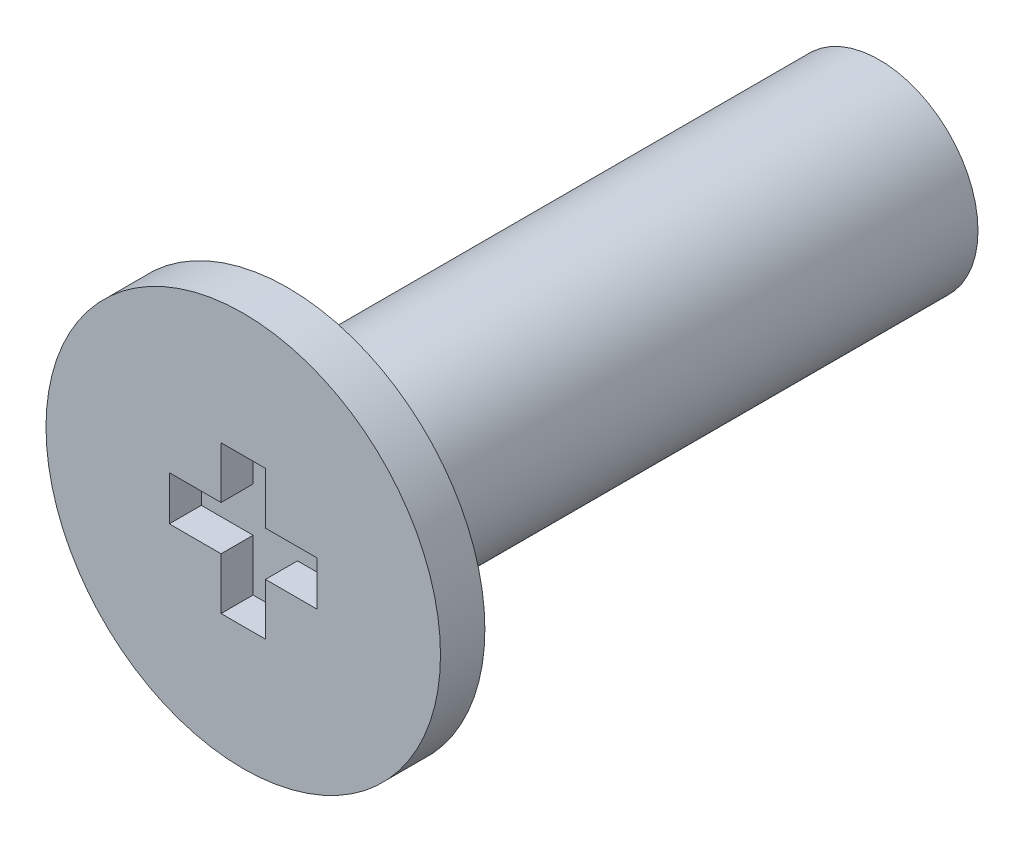
ISO-10303-21;
HEADER;
FILE_DESCRIPTION(('STEP AP214'),'2;1');
FILE_NAME('part.step','',(''),(''),'','','');
FILE_SCHEMA(('AUTOMOTIVE_DESIGN { 1 0 10303 214 1 1 1 1 }'));
ENDSEC;
DATA;
#1=APPLICATION_CONTEXT('core data for automotive mechanical design processes');
#2=APPLICATION_PROTOCOL_DEFINITION('international standard','automotive_design',2000,#1);
#3=PRODUCT_CONTEXT('',#1,'mechanical');
#4=PRODUCT('Part','Part','',(#3));
#5=PRODUCT_RELATED_PRODUCT_CATEGORY('part','',(#4));
#6=PRODUCT_DEFINITION_FORMATION('','',#4);
#7=PRODUCT_DEFINITION_CONTEXT('part definition',#1,'design');
#8=PRODUCT_DEFINITION('design','',#6,#7);
#9=PRODUCT_DEFINITION_SHAPE('','',#8);
#10=(LENGTH_UNIT() NAMED_UNIT(*) SI_UNIT(.MILLI.,.METRE.));
#11=(NAMED_UNIT(*) PLANE_ANGLE_UNIT() SI_UNIT($,.RADIAN.));
#12=(NAMED_UNIT(*) SI_UNIT($,.STERADIAN.) SOLID_ANGLE_UNIT());
#13=UNCERTAINTY_MEASURE_WITH_UNIT(LENGTH_MEASURE(1.E-05),#10,'distance_accuracy_value','');
#14=(GEOMETRIC_REPRESENTATION_CONTEXT(3) GLOBAL_UNCERTAINTY_ASSIGNED_CONTEXT((#13)) GLOBAL_UNIT_ASSIGNED_CONTEXT((#10,
#11,#12)) REPRESENTATION_CONTEXT('',''));
#15=CARTESIAN_POINT('',(0.,0.,0.));
#16=DIRECTION('',(0.,0.,1.));
#17=DIRECTION('',(1.,0.,0.));
#18=AXIS2_PLACEMENT_3D('',#15,#16,#17);
#19=CARTESIAN_POINT('',(0.,0.,-12.));
#20=DIRECTION('',(0.,0.,1.));
#21=DIRECTION('',(1.,0.,0.));
#22=AXIS2_PLACEMENT_3D('',#19,#20,#21);
#23=CYLINDRICAL_SURFACE('',#22,2.);
#24=CARTESIAN_POINT('',(0.,0.,-12.));
#25=DIRECTION('',(0.,0.,1.));
#26=DIRECTION('',(1.,0.,0.));
#27=AXIS2_PLACEMENT_3D('',#24,#25,#26);
#28=CIRCLE('',#27,2.);
#29=CARTESIAN_POINT('',(2.,0.,-12.));
#30=VERTEX_POINT('',#29);
#31=EDGE_CURVE('E245',#30,#30,#28,.T.);
#32=ORIENTED_EDGE('',*,*,#31,.T.);
#33=EDGE_LOOP('',(#32));
#34=FACE_BOUND('',#33,.T.);
#35=CARTESIAN_POINT('',(0.,0.,0.));
#36=DIRECTION('',(0.,0.,1.));
#37=DIRECTION('',(1.,0.,0.));
#38=AXIS2_PLACEMENT_3D('',#35,#36,#37);
#39=CIRCLE('',#38,2.);
#40=CARTESIAN_POINT('',(2.,0.,0.));
#41=VERTEX_POINT('',#40);
#42=EDGE_CURVE('E241',#41,#41,#39,.T.);
#43=ORIENTED_EDGE('',*,*,#42,.F.);
#44=EDGE_LOOP('',(#43));
#45=FACE_BOUND('',#44,.T.);
#46=ADVANCED_FACE('F44',(#34,#45),#23,.T.);
#47=CARTESIAN_POINT('',(0.,0.,-12.));
#48=DIRECTION('',(0.,0.,1.));
#49=DIRECTION('',(1.,0.,0.));
#50=AXIS2_PLACEMENT_3D('',#47,#48,#49);
#51=PLANE('',#50);
#52=ORIENTED_EDGE('',*,*,#31,.F.);
#53=EDGE_LOOP('',(#52));
#54=FACE_BOUND('',#53,.T.);
#55=ADVANCED_FACE('F326',(#54),#51,.F.);
#56=CARTESIAN_POINT('',(0.,0.,0.));
#57=DIRECTION('',(0.,0.,1.));
#58=DIRECTION('',(1.,0.,0.));
#59=AXIS2_PLACEMENT_3D('',#56,#57,#58);
#60=PLANE('',#59);
#61=ORIENTED_EDGE('',*,*,#42,.T.);
#62=EDGE_LOOP('',(#61));
#63=FACE_BOUND('',#62,.T.);
#64=CARTESIAN_POINT('',(0.,0.,0.));
#65=DIRECTION('',(0.,0.,-1.));
#66=DIRECTION('',(-1.,0.,0.));
#67=AXIS2_PLACEMENT_3D('',#64,#65,#66);
#68=CIRCLE('',#67,4.);
#69=CARTESIAN_POINT('',(-4.,0.,0.));
#70=VERTEX_POINT('',#69);
#71=EDGE_CURVE('E240',#70,#70,#68,.T.);
#72=ORIENTED_EDGE('',*,*,#71,.T.);
#73=EDGE_LOOP('',(#72));
#74=FACE_BOUND('',#73,.T.);
#75=ADVANCED_FACE('F331',(#63,#74),#60,.F.);
#76=CARTESIAN_POINT('',(0.,0.,-2.));
#77=DIRECTION('',(0.,0.,-1.));
#78=DIRECTION('',(-1.,0.,0.));
#79=AXIS2_PLACEMENT_3D('',#76,#77,#78);
#80=CYLINDRICAL_SURFACE('',#79,4.);
#81=ORIENTED_EDGE('',*,*,#71,.F.);
#82=EDGE_LOOP('',(#81));
#83=FACE_BOUND('',#82,.T.);
#84=CARTESIAN_POINT('',(0.,0.,0.9));
#85=DIRECTION('',(0.,0.,-1.));
#86=DIRECTION('',(-1.,0.,0.));
#87=AXIS2_PLACEMENT_3D('',#84,#85,#86);
#88=CIRCLE('',#87,4.);
#89=CARTESIAN_POINT('',(-4.,0.,0.9));
#90=VERTEX_POINT('',#89);
#91=EDGE_CURVE('E196',#90,#90,#88,.T.);
#92=ORIENTED_EDGE('',*,*,#91,.T.);
#93=EDGE_LOOP('',(#92));
#94=FACE_BOUND('',#93,.T.);
#95=ADVANCED_FACE('F341',(#83,#94),#80,.T.);
#96=CARTESIAN_POINT('',(4.,0.,0.9));
#97=DIRECTION('',(0.,0.,-1.));
#98=DIRECTION('',(-1.,0.,0.));
#99=AXIS2_PLACEMENT_3D('',#96,#97,#98);
#100=PLANE('',#99);
#101=DIRECTION('',(-1.,0.,0.));
#102=VECTOR('',#101,1.);
#103=CARTESIAN_POINT('',(4.,-1.5,0.9));
#104=LINE('',#103,#102);
#105=CARTESIAN_POINT('',(0.45,-1.5,0.9));
#106=VERTEX_POINT('',#105);
#107=CARTESIAN_POINT('',(-0.45,-1.5,0.9));
#108=VERTEX_POINT('',#107);
#109=EDGE_CURVE('E246',#106,#108,#104,.T.);
#110=ORIENTED_EDGE('',*,*,#109,.T.);
#111=DIRECTION('',(0.,1.,0.));
#112=VECTOR('',#111,1.);
#113=CARTESIAN_POINT('',(-0.45,0.,0.9));
#114=LINE('',#113,#112);
#115=CARTESIAN_POINT('',(-0.45,-0.45,0.9));
#116=VERTEX_POINT('',#115);
#117=EDGE_CURVE('E11',#108,#116,#114,.T.);
#118=ORIENTED_EDGE('',*,*,#117,.T.);
#119=DIRECTION('',(-1.,0.,0.));
#120=VECTOR('',#119,1.);
#121=CARTESIAN_POINT('',(4.,-0.45,0.9));
#122=LINE('',#121,#120);
#123=CARTESIAN_POINT('',(-1.5,-0.45,0.9));
#124=VERTEX_POINT('',#123);
#125=EDGE_CURVE('E52',#116,#124,#122,.T.);
#126=ORIENTED_EDGE('',*,*,#125,.T.);
#127=DIRECTION('',(0.,1.,0.));
#128=VECTOR('',#127,1.);
#129=CARTESIAN_POINT('',(-1.5,0.,0.9));
#130=LINE('',#129,#128);
#131=CARTESIAN_POINT('',(-1.5,0.45,0.9));
#132=VERTEX_POINT('',#131);
#133=EDGE_CURVE('E281',#124,#132,#130,.T.);
#134=ORIENTED_EDGE('',*,*,#133,.T.);
#135=DIRECTION('',(1.,0.,0.));
#136=VECTOR('',#135,1.);
#137=CARTESIAN_POINT('',(4.,0.45,0.9));
#138=LINE('',#137,#136);
#139=CARTESIAN_POINT('',(-0.45,0.45,0.9));
#140=VERTEX_POINT('',#139);
#141=EDGE_CURVE('E279',#132,#140,#138,.T.);
#142=ORIENTED_EDGE('',*,*,#141,.T.);
#143=DIRECTION('',(0.,1.,0.));
#144=VECTOR('',#143,1.);
#145=CARTESIAN_POINT('',(-0.45,0.,0.9));
#146=LINE('',#145,#144);
#147=CARTESIAN_POINT('',(-0.45,1.5,0.9));
#148=VERTEX_POINT('',#147);
#149=EDGE_CURVE('E276',#140,#148,#146,.T.);
#150=ORIENTED_EDGE('',*,*,#149,.T.);
#151=DIRECTION('',(1.,0.,0.));
#152=VECTOR('',#151,1.);
#153=CARTESIAN_POINT('',(4.,1.5,0.9));
#154=LINE('',#153,#152);
#155=CARTESIAN_POINT('',(0.45,1.5,0.9));
#156=VERTEX_POINT('',#155);
#157=EDGE_CURVE('E275',#148,#156,#154,.T.);
#158=ORIENTED_EDGE('',*,*,#157,.T.);
#159=DIRECTION('',(0.,-1.,0.));
#160=VECTOR('',#159,1.);
#161=CARTESIAN_POINT('',(0.45,0.,0.9));
#162=LINE('',#161,#160);
#163=CARTESIAN_POINT('',(0.45,0.45,0.9));
#164=VERTEX_POINT('',#163);
#165=EDGE_CURVE('E268',#156,#164,#162,.T.);
#166=ORIENTED_EDGE('',*,*,#165,.T.);
#167=DIRECTION('',(1.,0.,0.));
#168=VECTOR('',#167,1.);
#169=CARTESIAN_POINT('',(4.,0.45,0.9));
#170=LINE('',#169,#168);
#171=CARTESIAN_POINT('',(1.5,0.45,0.9));
#172=VERTEX_POINT('',#171);
#173=EDGE_CURVE('E264',#164,#172,#170,.T.);
#174=ORIENTED_EDGE('',*,*,#173,.T.);
#175=DIRECTION('',(0.,-1.,0.));
#176=VECTOR('',#175,1.);
#177=CARTESIAN_POINT('',(1.5,0.,0.9));
#178=LINE('',#177,#176);
#179=CARTESIAN_POINT('',(1.5,-0.45,0.9));
#180=VERTEX_POINT('',#179);
#181=EDGE_CURVE('E259',#172,#180,#178,.T.);
#182=ORIENTED_EDGE('',*,*,#181,.T.);
#183=DIRECTION('',(-1.,0.,0.));
#184=VECTOR('',#183,1.);
#185=CARTESIAN_POINT('',(4.,-0.45,0.9));
#186=LINE('',#185,#184);
#187=CARTESIAN_POINT('',(0.45,-0.45,0.9));
#188=VERTEX_POINT('',#187);
#189=EDGE_CURVE('E258',#180,#188,#186,.T.);
#190=ORIENTED_EDGE('',*,*,#189,.T.);
#191=DIRECTION('',(0.,-1.,0.));
#192=VECTOR('',#191,1.);
#193=CARTESIAN_POINT('',(0.45,0.,0.9));
#194=LINE('',#193,#192);
#195=EDGE_CURVE('E255',#188,#106,#194,.T.);
#196=ORIENTED_EDGE('',*,*,#195,.T.);
#197=EDGE_LOOP('',(#110,#118,#126,#134,#142,#150,#158,#166,#174,#182,#190,#196));
#198=FACE_BOUND('',#197,.T.);
#199=ORIENTED_EDGE('',*,*,#91,.F.);
#200=EDGE_LOOP('',(#199));
#201=FACE_BOUND('',#200,.T.);
#202=ADVANCED_FACE('F286',(#198,#201),#100,.F.);
#203=CARTESIAN_POINT('',(-0.45,-0.45,0.25));
#204=DIRECTION('',(-1.,0.,0.));
#205=DIRECTION('',(0.,0.,1.));
#206=AXIS2_PLACEMENT_3D('',#203,#204,#205);
#207=PLANE('',#206);
#208=DIRECTION('',(0.,0.,1.));
#209=VECTOR('',#208,1.);
#210=CARTESIAN_POINT('',(-0.45,-1.5,0.25));
#211=LINE('',#210,#209);
#212=CARTESIAN_POINT('',(-0.45,-1.5,0.25));
#213=VERTEX_POINT('',#212);
#214=EDGE_CURVE('E58',#213,#108,#211,.T.);
#215=ORIENTED_EDGE('',*,*,#214,.F.);
#216=DIRECTION('',(0.,-1.,0.));
#217=VECTOR('',#216,1.);
#218=CARTESIAN_POINT('',(-0.45,-0.45,0.25));
#219=LINE('',#218,#217);
#220=CARTESIAN_POINT('',(-0.45,-0.45,0.25));
#221=VERTEX_POINT('',#220);
#222=EDGE_CURVE('E133',#221,#213,#219,.T.);
#223=ORIENTED_EDGE('',*,*,#222,.F.);
#224=DIRECTION('',(0.,0.,1.));
#225=VECTOR('',#224,1.);
#226=CARTESIAN_POINT('',(-0.45,-0.45,0.25));
#227=LINE('',#226,#225);
#228=EDGE_CURVE('E193',#221,#116,#227,.T.);
#229=ORIENTED_EDGE('',*,*,#228,.T.);
#230=ORIENTED_EDGE('',*,*,#117,.F.);
#231=EDGE_LOOP('',(#215,#223,#229,#230));
#232=FACE_BOUND('',#231,.T.);
#233=ADVANCED_FACE('F134',(#232),#207,.F.);
#234=CARTESIAN_POINT('',(-1.5,-0.45,0.25));
#235=DIRECTION('',(0.,-1.,0.));
#236=DIRECTION('',(0.,0.,-1.));
#237=AXIS2_PLACEMENT_3D('',#234,#235,#236);
#238=PLANE('',#237);
#239=ORIENTED_EDGE('',*,*,#228,.F.);
#240=DIRECTION('',(1.,0.,0.));
#241=VECTOR('',#240,1.);
#242=CARTESIAN_POINT('',(-1.5,-0.45,0.25));
#243=LINE('',#242,#241);
#244=CARTESIAN_POINT('',(-1.5,-0.45,0.25));
#245=VERTEX_POINT('',#244);
#246=EDGE_CURVE('E138',#245,#221,#243,.T.);
#247=ORIENTED_EDGE('',*,*,#246,.F.);
#248=DIRECTION('',(0.,0.,1.));
#249=VECTOR('',#248,1.);
#250=CARTESIAN_POINT('',(-1.5,-0.45,0.25));
#251=LINE('',#250,#249);
#252=EDGE_CURVE('E200',#245,#124,#251,.T.);
#253=ORIENTED_EDGE('',*,*,#252,.T.);
#254=ORIENTED_EDGE('',*,*,#125,.F.);
#255=EDGE_LOOP('',(#239,#247,#253,#254));
#256=FACE_BOUND('',#255,.T.);
#257=ADVANCED_FACE('F320',(#256),#238,.F.);
#258=CARTESIAN_POINT('',(-1.5,0.45,0.25));
#259=DIRECTION('',(-1.,0.,0.));
#260=DIRECTION('',(0.,0.,1.));
#261=AXIS2_PLACEMENT_3D('',#258,#259,#260);
#262=PLANE('',#261);
#263=ORIENTED_EDGE('',*,*,#252,.F.);
#264=DIRECTION('',(0.,-1.,0.));
#265=VECTOR('',#264,1.);
#266=CARTESIAN_POINT('',(-1.5,0.45,0.25));
#267=LINE('',#266,#265);
#268=CARTESIAN_POINT('',(-1.5,0.45,0.25));
#269=VERTEX_POINT('',#268);
#270=EDGE_CURVE('E186',#269,#245,#267,.T.);
#271=ORIENTED_EDGE('',*,*,#270,.F.);
#272=DIRECTION('',(0.,0.,1.));
#273=VECTOR('',#272,1.);
#274=CARTESIAN_POINT('',(-1.5,0.45,0.25));
#275=LINE('',#274,#273);
#276=EDGE_CURVE('E199',#269,#132,#275,.T.);
#277=ORIENTED_EDGE('',*,*,#276,.T.);
#278=ORIENTED_EDGE('',*,*,#133,.F.);
#279=EDGE_LOOP('',(#263,#271,#277,#278));
#280=FACE_BOUND('',#279,.T.);
#281=ADVANCED_FACE('F316',(#280),#262,.F.);
#282=CARTESIAN_POINT('',(-0.45,0.45,0.25));
#283=DIRECTION('',(0.,1.,0.));
#284=DIRECTION('',(0.,0.,1.));
#285=AXIS2_PLACEMENT_3D('',#282,#283,#284);
#286=PLANE('',#285);
#287=ORIENTED_EDGE('',*,*,#276,.F.);
#288=DIRECTION('',(-1.,0.,0.));
#289=VECTOR('',#288,1.);
#290=CARTESIAN_POINT('',(-0.45,0.45,0.25));
#291=LINE('',#290,#289);
#292=CARTESIAN_POINT('',(-0.45,0.45,0.25));
#293=VERTEX_POINT('',#292);
#294=EDGE_CURVE('E185',#293,#269,#291,.T.);
#295=ORIENTED_EDGE('',*,*,#294,.F.);
#296=DIRECTION('',(0.,0.,1.));
#297=VECTOR('',#296,1.);
#298=CARTESIAN_POINT('',(-0.45,0.45,0.25));
#299=LINE('',#298,#297);
#300=EDGE_CURVE('E203',#293,#140,#299,.T.);
#301=ORIENTED_EDGE('',*,*,#300,.T.);
#302=ORIENTED_EDGE('',*,*,#141,.F.);
#303=EDGE_LOOP('',(#287,#295,#301,#302));
#304=FACE_BOUND('',#303,.T.);
#305=ADVANCED_FACE('F311',(#304),#286,.F.);
#306=CARTESIAN_POINT('',(-0.45,1.5,0.25));
#307=DIRECTION('',(-1.,0.,0.));
#308=DIRECTION('',(0.,0.,1.));
#309=AXIS2_PLACEMENT_3D('',#306,#307,#308);
#310=PLANE('',#309);
#311=ORIENTED_EDGE('',*,*,#300,.F.);
#312=DIRECTION('',(0.,-1.,0.));
#313=VECTOR('',#312,1.);
#314=CARTESIAN_POINT('',(-0.45,1.5,0.25));
#315=LINE('',#314,#313);
#316=CARTESIAN_POINT('',(-0.45,1.5,0.25));
#317=VERTEX_POINT('',#316);
#318=EDGE_CURVE('E177',#317,#293,#315,.T.);
#319=ORIENTED_EDGE('',*,*,#318,.F.);
#320=DIRECTION('',(0.,0.,1.));
#321=VECTOR('',#320,1.);
#322=CARTESIAN_POINT('',(-0.45,1.5,0.25));
#323=LINE('',#322,#321);
#324=EDGE_CURVE('E209',#317,#148,#323,.T.);
#325=ORIENTED_EDGE('',*,*,#324,.T.);
#326=ORIENTED_EDGE('',*,*,#149,.F.);
#327=EDGE_LOOP('',(#311,#319,#325,#326));
#328=FACE_BOUND('',#327,.T.);
#329=ADVANCED_FACE('F308',(#328),#310,.F.);
#330=CARTESIAN_POINT('',(0.45,1.5,0.25));
#331=DIRECTION('',(0.,1.,0.));
#332=DIRECTION('',(0.,0.,1.));
#333=AXIS2_PLACEMENT_3D('',#330,#331,#332);
#334=PLANE('',#333);
#335=ORIENTED_EDGE('',*,*,#324,.F.);
#336=DIRECTION('',(-1.,0.,0.));
#337=VECTOR('',#336,1.);
#338=CARTESIAN_POINT('',(0.45,1.5,0.25));
#339=LINE('',#338,#337);
#340=CARTESIAN_POINT('',(0.45,1.5,0.25));
#341=VERTEX_POINT('',#340);
#342=EDGE_CURVE('E178',#341,#317,#339,.T.);
#343=ORIENTED_EDGE('',*,*,#342,.F.);
#344=DIRECTION('',(0.,0.,1.));
#345=VECTOR('',#344,1.);
#346=CARTESIAN_POINT('',(0.45,1.5,0.25));
#347=LINE('',#346,#345);
#348=EDGE_CURVE('E215',#341,#156,#347,.T.);
#349=ORIENTED_EDGE('',*,*,#348,.T.);
#350=ORIENTED_EDGE('',*,*,#157,.F.);
#351=EDGE_LOOP('',(#335,#343,#349,#350));
#352=FACE_BOUND('',#351,.T.);
#353=ADVANCED_FACE('F310',(#352),#334,.F.);
#354=CARTESIAN_POINT('',(0.45,0.45,0.25));
#355=DIRECTION('',(1.,0.,0.));
#356=DIRECTION('',(0.,0.,-1.));
#357=AXIS2_PLACEMENT_3D('',#354,#355,#356);
#358=PLANE('',#357);
#359=ORIENTED_EDGE('',*,*,#348,.F.);
#360=DIRECTION('',(0.,1.,0.));
#361=VECTOR('',#360,1.);
#362=CARTESIAN_POINT('',(0.45,0.45,0.25));
#363=LINE('',#362,#361);
#364=CARTESIAN_POINT('',(0.45,0.45,0.25));
#365=VERTEX_POINT('',#364);
#366=EDGE_CURVE('E175',#365,#341,#363,.T.);
#367=ORIENTED_EDGE('',*,*,#366,.F.);
#368=DIRECTION('',(0.,0.,1.));
#369=VECTOR('',#368,1.);
#370=CARTESIAN_POINT('',(0.45,0.45,0.25));
#371=LINE('',#370,#369);
#372=EDGE_CURVE('E216',#365,#164,#371,.T.);
#373=ORIENTED_EDGE('',*,*,#372,.T.);
#374=ORIENTED_EDGE('',*,*,#165,.F.);
#375=EDGE_LOOP('',(#359,#367,#373,#374));
#376=FACE_BOUND('',#375,.T.);
#377=ADVANCED_FACE('F302',(#376),#358,.F.);
#378=CARTESIAN_POINT('',(1.5,0.45,0.25));
#379=DIRECTION('',(0.,1.,0.));
#380=DIRECTION('',(0.,0.,1.));
#381=AXIS2_PLACEMENT_3D('',#378,#379,#380);
#382=PLANE('',#381);
#383=ORIENTED_EDGE('',*,*,#372,.F.);
#384=DIRECTION('',(-1.,0.,0.));
#385=VECTOR('',#384,1.);
#386=CARTESIAN_POINT('',(1.5,0.45,0.25));
#387=LINE('',#386,#385);
#388=CARTESIAN_POINT('',(1.5,0.45,0.25));
#389=VERTEX_POINT('',#388);
#390=EDGE_CURVE('E167',#389,#365,#387,.T.);
#391=ORIENTED_EDGE('',*,*,#390,.F.);
#392=DIRECTION('',(0.,0.,1.));
#393=VECTOR('',#392,1.);
#394=CARTESIAN_POINT('',(1.5,0.45,0.25));
#395=LINE('',#394,#393);
#396=EDGE_CURVE('E219',#389,#172,#395,.T.);
#397=ORIENTED_EDGE('',*,*,#396,.T.);
#398=ORIENTED_EDGE('',*,*,#173,.F.);
#399=EDGE_LOOP('',(#383,#391,#397,#398));
#400=FACE_BOUND('',#399,.T.);
#401=ADVANCED_FACE('F303',(#400),#382,.F.);
#402=CARTESIAN_POINT('',(1.5,-0.45,0.25));
#403=DIRECTION('',(1.,0.,0.));
#404=DIRECTION('',(0.,0.,-1.));
#405=AXIS2_PLACEMENT_3D('',#402,#403,#404);
#406=PLANE('',#405);
#407=ORIENTED_EDGE('',*,*,#396,.F.);
#408=DIRECTION('',(0.,1.,0.));
#409=VECTOR('',#408,1.);
#410=CARTESIAN_POINT('',(1.5,-0.45,0.25));
#411=LINE('',#410,#409);
#412=CARTESIAN_POINT('',(1.5,-0.45,0.25));
#413=VERTEX_POINT('',#412);
#414=EDGE_CURVE('E161',#413,#389,#411,.T.);
#415=ORIENTED_EDGE('',*,*,#414,.F.);
#416=DIRECTION('',(0.,0.,1.));
#417=VECTOR('',#416,1.);
#418=CARTESIAN_POINT('',(1.5,-0.45,0.25));
#419=LINE('',#418,#417);
#420=EDGE_CURVE('E222',#413,#180,#419,.T.);
#421=ORIENTED_EDGE('',*,*,#420,.T.);
#422=ORIENTED_EDGE('',*,*,#181,.F.);
#423=EDGE_LOOP('',(#407,#415,#421,#422));
#424=FACE_BOUND('',#423,.T.);
#425=ADVANCED_FACE('F298',(#424),#406,.F.);
#426=CARTESIAN_POINT('',(0.45,-0.45,0.25));
#427=DIRECTION('',(0.,-1.,0.));
#428=DIRECTION('',(0.,0.,-1.));
#429=AXIS2_PLACEMENT_3D('',#426,#427,#428);
#430=PLANE('',#429);
#431=ORIENTED_EDGE('',*,*,#420,.F.);
#432=DIRECTION('',(1.,0.,0.));
#433=VECTOR('',#432,1.);
#434=CARTESIAN_POINT('',(0.45,-0.45,0.25));
#435=LINE('',#434,#433);
#436=CARTESIAN_POINT('',(0.45,-0.45,0.25));
#437=VERTEX_POINT('',#436);
#438=EDGE_CURVE('E158',#437,#413,#435,.T.);
#439=ORIENTED_EDGE('',*,*,#438,.F.);
#440=DIRECTION('',(0.,0.,1.));
#441=VECTOR('',#440,1.);
#442=CARTESIAN_POINT('',(0.45,-0.45,0.25));
#443=LINE('',#442,#441);
#444=EDGE_CURVE('E226',#437,#188,#443,.T.);
#445=ORIENTED_EDGE('',*,*,#444,.T.);
#446=ORIENTED_EDGE('',*,*,#189,.F.);
#447=EDGE_LOOP('',(#431,#439,#445,#446));
#448=FACE_BOUND('',#447,.T.);
#449=ADVANCED_FACE('F296',(#448),#430,.F.);
#450=CARTESIAN_POINT('',(0.45,-1.5,0.25));
#451=DIRECTION('',(1.,0.,0.));
#452=DIRECTION('',(0.,0.,-1.));
#453=AXIS2_PLACEMENT_3D('',#450,#451,#452);
#454=PLANE('',#453);
#455=ORIENTED_EDGE('',*,*,#444,.F.);
#456=DIRECTION('',(0.,1.,0.));
#457=VECTOR('',#456,1.);
#458=CARTESIAN_POINT('',(0.45,-1.5,0.25));
#459=LINE('',#458,#457);
#460=CARTESIAN_POINT('',(0.45,-1.5,0.25));
#461=VERTEX_POINT('',#460);
#462=EDGE_CURVE('E149',#461,#437,#459,.T.);
#463=ORIENTED_EDGE('',*,*,#462,.F.);
#464=DIRECTION('',(0.,0.,1.));
#465=VECTOR('',#464,1.);
#466=CARTESIAN_POINT('',(0.45,-1.5,0.25));
#467=LINE('',#466,#465);
#468=EDGE_CURVE('E136',#461,#106,#467,.T.);
#469=ORIENTED_EDGE('',*,*,#468,.T.);
#470=ORIENTED_EDGE('',*,*,#195,.F.);
#471=EDGE_LOOP('',(#455,#463,#469,#470));
#472=FACE_BOUND('',#471,.T.);
#473=ADVANCED_FACE('F295',(#472),#454,.F.);
#474=CARTESIAN_POINT('',(-0.45,-1.5,0.25));
#475=DIRECTION('',(0.,-1.,0.));
#476=DIRECTION('',(0.,0.,-1.));
#477=AXIS2_PLACEMENT_3D('',#474,#475,#476);
#478=PLANE('',#477);
#479=ORIENTED_EDGE('',*,*,#468,.F.);
#480=DIRECTION('',(1.,0.,0.));
#481=VECTOR('',#480,1.);
#482=CARTESIAN_POINT('',(-0.45,-1.5,0.25));
#483=LINE('',#482,#481);
#484=EDGE_CURVE('E142',#213,#461,#483,.T.);
#485=ORIENTED_EDGE('',*,*,#484,.F.);
#486=ORIENTED_EDGE('',*,*,#214,.T.);
#487=ORIENTED_EDGE('',*,*,#109,.F.);
#488=EDGE_LOOP('',(#479,#485,#486,#487));
#489=FACE_BOUND('',#488,.T.);
#490=ADVANCED_FACE('F143',(#489),#478,.F.);
#491=CARTESIAN_POINT('',(0.,0.,0.25));
#492=DIRECTION('',(0.,0.,1.));
#493=DIRECTION('',(1.,0.,0.));
#494=AXIS2_PLACEMENT_3D('',#491,#492,#493);
#495=PLANE('',#494);
#496=ORIENTED_EDGE('',*,*,#222,.T.);
#497=ORIENTED_EDGE('',*,*,#484,.T.);
#498=ORIENTED_EDGE('',*,*,#462,.T.);
#499=ORIENTED_EDGE('',*,*,#438,.T.);
#500=ORIENTED_EDGE('',*,*,#414,.T.);
#501=ORIENTED_EDGE('',*,*,#390,.T.);
#502=ORIENTED_EDGE('',*,*,#366,.T.);
#503=ORIENTED_EDGE('',*,*,#342,.T.);
#504=ORIENTED_EDGE('',*,*,#318,.T.);
#505=ORIENTED_EDGE('',*,*,#294,.T.);
#506=ORIENTED_EDGE('',*,*,#270,.T.);
#507=ORIENTED_EDGE('',*,*,#246,.T.);
#508=EDGE_LOOP('',(#496,#497,#498,#499,#500,#501,#502,#503,#504,#505,#506,#507));
#509=FACE_BOUND('',#508,.T.);
#510=ADVANCED_FACE('F155',(#509),#495,.T.);
#511=CLOSED_SHELL('',(#46,#55,#75,#95,#202,#233,#257,#281,#305,#329,#353,#377,#401,#425,#449,
#473,#490,#510));
#512=MANIFOLD_SOLID_BREP('B2',#511);
#513=ADVANCED_BREP_SHAPE_REPRESENTATION('',(#18,#512),#14);
#514=SHAPE_DEFINITION_REPRESENTATION(#9,#513);
ENDSEC;
END-ISO-10303-21;
